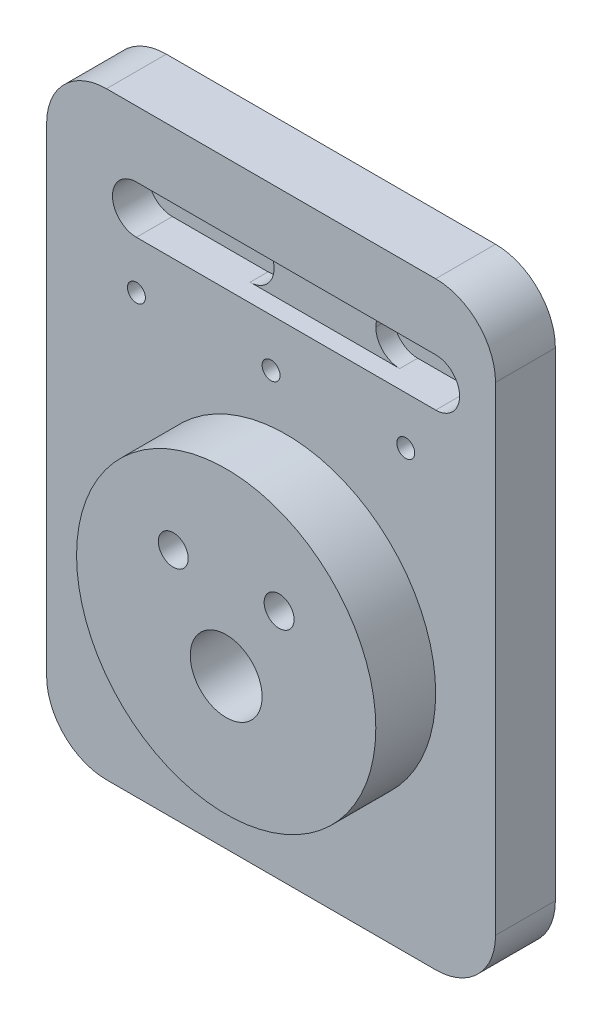
ISO-10303-21;
HEADER;
FILE_DESCRIPTION(('STEP AP214'),'2;1');
FILE_NAME('part.step','',(''),(''),'','','');
FILE_SCHEMA(('AUTOMOTIVE_DESIGN { 1 0 10303 214 1 1 1 1 }'));
ENDSEC;
DATA;
#1=APPLICATION_CONTEXT('core data for automotive mechanical design processes');
#2=APPLICATION_PROTOCOL_DEFINITION('international standard','automotive_design',2000,#1);
#3=PRODUCT_CONTEXT('',#1,'mechanical');
#4=PRODUCT('Part','Part','',(#3));
#5=PRODUCT_RELATED_PRODUCT_CATEGORY('part','',(#4));
#6=PRODUCT_DEFINITION_FORMATION('','',#4);
#7=PRODUCT_DEFINITION_CONTEXT('part definition',#1,'design');
#8=PRODUCT_DEFINITION('design','',#6,#7);
#9=PRODUCT_DEFINITION_SHAPE('','',#8);
#10=(LENGTH_UNIT() NAMED_UNIT(*) SI_UNIT(.MILLI.,.METRE.));
#11=(NAMED_UNIT(*) PLANE_ANGLE_UNIT() SI_UNIT($,.RADIAN.));
#12=(NAMED_UNIT(*) SI_UNIT($,.STERADIAN.) SOLID_ANGLE_UNIT());
#13=UNCERTAINTY_MEASURE_WITH_UNIT(LENGTH_MEASURE(1.E-05),#10,'distance_accuracy_value','');
#14=(GEOMETRIC_REPRESENTATION_CONTEXT(3) GLOBAL_UNCERTAINTY_ASSIGNED_CONTEXT((#13)) GLOBAL_UNIT_ASSIGNED_CONTEXT((#10,
#11,#12)) REPRESENTATION_CONTEXT('',''));
#15=CARTESIAN_POINT('',(0.,0.,0.));
#16=DIRECTION('',(0.,0.,1.));
#17=DIRECTION('',(1.,0.,0.));
#18=AXIS2_PLACEMENT_3D('',#15,#16,#17);
#19=CARTESIAN_POINT('',(15.,89.,4.));
#20=DIRECTION('',(0.,1.,0.));
#21=DIRECTION('',(-1.,0.,0.));
#22=AXIS2_PLACEMENT_3D('',#19,#20,#21);
#23=PLANE('',#22);
#24=DIRECTION('',(-1.,0.,0.));
#25=VECTOR('',#24,1.);
#26=CARTESIAN_POINT('',(35.,89.,7.));
#27=LINE('',#26,#25);
#28=CARTESIAN_POINT('',(56.,89.,7.));
#29=VERTEX_POINT('',#28);
#30=CARTESIAN_POINT('',(31.,89.,7.));
#31=VERTEX_POINT('',#30);
#32=EDGE_CURVE('E386',#29,#31,#27,.T.);
#33=ORIENTED_EDGE('',*,*,#32,.F.);
#34=DIRECTION('',(0.,0.,-1.));
#35=VECTOR('',#34,1.);
#36=CARTESIAN_POINT('',(56.,89.,4.));
#37=LINE('',#36,#35);
#38=CARTESIAN_POINT('',(56.,89.,4.));
#39=VERTEX_POINT('',#38);
#40=EDGE_CURVE('E362',#29,#39,#37,.T.);
#41=ORIENTED_EDGE('',*,*,#40,.T.);
#42=DIRECTION('',(-1.,0.,0.));
#43=VECTOR('',#42,1.);
#44=CARTESIAN_POINT('',(15.,89.,4.));
#45=LINE('',#44,#43);
#46=CARTESIAN_POINT('',(65.,89.,4.));
#47=VERTEX_POINT('',#46);
#48=EDGE_CURVE('E178',#47,#39,#45,.T.);
#49=ORIENTED_EDGE('',*,*,#48,.F.);
#50=DIRECTION('',(0.,0.,1.));
#51=VECTOR('',#50,1.);
#52=CARTESIAN_POINT('',(65.,89.,4.));
#53=LINE('',#52,#51);
#54=CARTESIAN_POINT('',(65.,89.,10.));
#55=VERTEX_POINT('',#54);
#56=EDGE_CURVE('E226',#47,#55,#53,.T.);
#57=ORIENTED_EDGE('',*,*,#56,.T.);
#58=DIRECTION('',(-1.,0.,0.));
#59=VECTOR('',#58,1.);
#60=CARTESIAN_POINT('',(15.,89.,10.));
#61=LINE('',#60,#59);
#62=CARTESIAN_POINT('',(15.,89.,10.));
#63=VERTEX_POINT('',#62);
#64=EDGE_CURVE('E197',#55,#63,#61,.T.);
#65=ORIENTED_EDGE('',*,*,#64,.T.);
#66=DIRECTION('',(0.,0.,1.));
#67=VECTOR('',#66,1.);
#68=CARTESIAN_POINT('',(15.,89.,4.));
#69=LINE('',#68,#67);
#70=CARTESIAN_POINT('',(15.,89.,4.));
#71=VERTEX_POINT('',#70);
#72=EDGE_CURVE('E222',#71,#63,#69,.T.);
#73=ORIENTED_EDGE('',*,*,#72,.F.);
#74=CARTESIAN_POINT('',(31.,89.,4.));
#75=VERTEX_POINT('',#74);
#76=EDGE_CURVE('E194',#75,#71,#45,.T.);
#77=ORIENTED_EDGE('',*,*,#76,.F.);
#78=DIRECTION('',(0.,0.,-1.));
#79=VECTOR('',#78,1.);
#80=CARTESIAN_POINT('',(31.,89.,7.));
#81=LINE('',#80,#79);
#82=EDGE_CURVE('E358',#75,#31,#81,.F.);
#83=ORIENTED_EDGE('',*,*,#82,.T.);
#84=EDGE_LOOP('',(#33,#41,#49,#57,#65,#73,#77,#83));
#85=FACE_BOUND('',#84,.T.);
#86=ADVANCED_FACE('F39',(#85),#23,.F.);
#87=CARTESIAN_POINT('',(15.,81.,4.));
#88=DIRECTION('',(0.,-1.,0.));
#89=DIRECTION('',(0.,0.,-1.));
#90=AXIS2_PLACEMENT_3D('',#87,#88,#89);
#91=PLANE('',#90);
#92=DIRECTION('',(1.,0.,0.));
#93=VECTOR('',#92,1.);
#94=CARTESIAN_POINT('',(15.,81.,4.));
#95=LINE('',#94,#93);
#96=CARTESIAN_POINT('',(56.,81.,4.));
#97=VERTEX_POINT('',#96);
#98=CARTESIAN_POINT('',(65.,81.,4.));
#99=VERTEX_POINT('',#98);
#100=EDGE_CURVE('E190',#97,#99,#95,.T.);
#101=ORIENTED_EDGE('',*,*,#100,.F.);
#102=DIRECTION('',(0.,0.,-1.));
#103=VECTOR('',#102,1.);
#104=CARTESIAN_POINT('',(56.,81.,7.));
#105=LINE('',#104,#103);
#106=CARTESIAN_POINT('',(56.,81.,7.));
#107=VERTEX_POINT('',#106);
#108=EDGE_CURVE('E354',#97,#107,#105,.F.);
#109=ORIENTED_EDGE('',*,*,#108,.T.);
#110=DIRECTION('',(1.,0.,0.));
#111=VECTOR('',#110,1.);
#112=CARTESIAN_POINT('',(35.,81.,7.));
#113=LINE('',#112,#111);
#114=CARTESIAN_POINT('',(31.,81.,7.));
#115=VERTEX_POINT('',#114);
#116=EDGE_CURVE('E380',#115,#107,#113,.T.);
#117=ORIENTED_EDGE('',*,*,#116,.F.);
#118=DIRECTION('',(0.,0.,-1.));
#119=VECTOR('',#118,1.);
#120=CARTESIAN_POINT('',(31.,81.,4.));
#121=LINE('',#120,#119);
#122=CARTESIAN_POINT('',(31.,81.,4.));
#123=VERTEX_POINT('',#122);
#124=EDGE_CURVE('E186',#115,#123,#121,.T.);
#125=ORIENTED_EDGE('',*,*,#124,.T.);
#126=CARTESIAN_POINT('',(15.,81.,4.));
#127=VERTEX_POINT('',#126);
#128=EDGE_CURVE('E182',#127,#123,#95,.T.);
#129=ORIENTED_EDGE('',*,*,#128,.F.);
#130=DIRECTION('',(0.,0.,1.));
#131=VECTOR('',#130,1.);
#132=CARTESIAN_POINT('',(15.,81.,4.));
#133=LINE('',#132,#131);
#134=CARTESIAN_POINT('',(15.,81.,10.));
#135=VERTEX_POINT('',#134);
#136=EDGE_CURVE('E166',#127,#135,#133,.T.);
#137=ORIENTED_EDGE('',*,*,#136,.T.);
#138=DIRECTION('',(1.,0.,0.));
#139=VECTOR('',#138,1.);
#140=CARTESIAN_POINT('',(15.,81.,10.));
#141=LINE('',#140,#139);
#142=CARTESIAN_POINT('',(65.,81.,10.));
#143=VERTEX_POINT('',#142);
#144=EDGE_CURVE('E216',#135,#143,#141,.T.);
#145=ORIENTED_EDGE('',*,*,#144,.T.);
#146=DIRECTION('',(0.,0.,1.));
#147=VECTOR('',#146,1.);
#148=CARTESIAN_POINT('',(65.,81.,4.));
#149=LINE('',#148,#147);
#150=EDGE_CURVE('E177',#99,#143,#149,.T.);
#151=ORIENTED_EDGE('',*,*,#150,.F.);
#152=EDGE_LOOP('',(#101,#109,#117,#125,#129,#137,#145,#151));
#153=FACE_BOUND('',#152,.T.);
#154=ADVANCED_FACE('F184',(#153),#91,.F.);
#155=CARTESIAN_POINT('',(15.,85.,4.));
#156=DIRECTION('',(0.,0.,1.));
#157=DIRECTION('',(1.,0.,0.));
#158=AXIS2_PLACEMENT_3D('',#155,#156,#157);
#159=PLANE('',#158);
#160=ORIENTED_EDGE('',*,*,#128,.T.);
#161=CARTESIAN_POINT('',(31.,85.,4.));
#162=DIRECTION('',(0.,0.,1.));
#163=DIRECTION('',(1.,0.,0.));
#164=AXIS2_PLACEMENT_3D('',#161,#162,#163);
#165=CIRCLE('',#164,4.);
#166=CARTESIAN_POINT('',(35.,85.,4.));
#167=VERTEX_POINT('',#166);
#168=EDGE_CURVE('E368',#123,#167,#165,.T.);
#169=ORIENTED_EDGE('',*,*,#168,.T.);
#170=CARTESIAN_POINT('',(31.,85.,4.));
#171=DIRECTION('',(0.,0.,1.));
#172=DIRECTION('',(1.,0.,0.));
#173=AXIS2_PLACEMENT_3D('',#170,#171,#172);
#174=CIRCLE('',#173,4.);
#175=EDGE_CURVE('E365',#167,#75,#174,.T.);
#176=ORIENTED_EDGE('',*,*,#175,.T.);
#177=ORIENTED_EDGE('',*,*,#76,.T.);
#178=CARTESIAN_POINT('',(15.,85.,4.));
#179=DIRECTION('',(0.,0.,1.));
#180=DIRECTION('',(1.,0.,0.));
#181=AXIS2_PLACEMENT_3D('',#178,#179,#180);
#182=CIRCLE('',#181,3.99999999999999);
#183=EDGE_CURVE('E170',#71,#127,#182,.T.);
#184=ORIENTED_EDGE('',*,*,#183,.T.);
#185=EDGE_LOOP('',(#160,#169,#176,#177,#184));
#186=FACE_BOUND('',#185,.T.);
#187=ADVANCED_FACE('F192',(#186),#159,.T.);
#188=CARTESIAN_POINT('',(56.,85.,4.));
#189=DIRECTION('',(0.,0.,1.));
#190=DIRECTION('',(1.,0.,0.));
#191=AXIS2_PLACEMENT_3D('',#188,#189,#190);
#192=CIRCLE('',#191,4.);
#193=CARTESIAN_POINT('',(52.,85.,4.));
#194=VERTEX_POINT('',#193);
#195=EDGE_CURVE('E346',#39,#194,#192,.T.);
#196=ORIENTED_EDGE('',*,*,#195,.T.);
#197=CARTESIAN_POINT('',(56.,85.,4.));
#198=DIRECTION('',(0.,0.,1.));
#199=DIRECTION('',(1.,0.,0.));
#200=AXIS2_PLACEMENT_3D('',#197,#198,#199);
#201=CIRCLE('',#200,4.);
#202=EDGE_CURVE('E349',#194,#97,#201,.T.);
#203=ORIENTED_EDGE('',*,*,#202,.T.);
#204=ORIENTED_EDGE('',*,*,#100,.T.);
#205=CARTESIAN_POINT('',(65.,85.,4.));
#206=DIRECTION('',(0.,0.,1.));
#207=DIRECTION('',(1.,0.,0.));
#208=AXIS2_PLACEMENT_3D('',#205,#206,#207);
#209=CIRCLE('',#208,4.);
#210=EDGE_CURVE('E189',#99,#47,#209,.T.);
#211=ORIENTED_EDGE('',*,*,#210,.T.);
#212=ORIENTED_EDGE('',*,*,#48,.T.);
#213=EDGE_LOOP('',(#196,#203,#204,#211,#212));
#214=FACE_BOUND('',#213,.T.);
#215=ADVANCED_FACE('F409',(#214),#159,.T.);
#216=CARTESIAN_POINT('',(0.,0.,0.));
#217=DIRECTION('',(0.,0.,-1.));
#218=DIRECTION('',(-1.,0.,0.));
#219=AXIS2_PLACEMENT_3D('',#216,#217,#218);
#220=PLANE('',#219);
#221=CARTESIAN_POINT('',(15.,73.,0.));
#222=DIRECTION('',(0.,0.,1.));
#223=DIRECTION('',(1.,0.,0.));
#224=AXIS2_PLACEMENT_3D('',#221,#222,#223);
#225=CIRCLE('',#224,1.5);
#226=CARTESIAN_POINT('',(16.5,73.,0.));
#227=VERTEX_POINT('',#226);
#228=EDGE_CURVE('E681',#227,#227,#225,.T.);
#229=ORIENTED_EDGE('',*,*,#228,.T.);
#230=EDGE_LOOP('',(#229));
#231=FACE_BOUND('',#230,.T.);
#232=CARTESIAN_POINT('',(37.5,73.,0.));
#233=DIRECTION('',(0.,0.,1.));
#234=DIRECTION('',(1.,0.,0.));
#235=AXIS2_PLACEMENT_3D('',#232,#233,#234);
#236=CIRCLE('',#235,1.49999999999999);
#237=CARTESIAN_POINT('',(39.,73.,0.));
#238=VERTEX_POINT('',#237);
#239=EDGE_CURVE('E675',#238,#238,#236,.T.);
#240=ORIENTED_EDGE('',*,*,#239,.T.);
#241=EDGE_LOOP('',(#240));
#242=FACE_BOUND('',#241,.T.);
#243=CARTESIAN_POINT('',(60.,73.,0.));
#244=DIRECTION('',(0.,0.,1.));
#245=DIRECTION('',(1.,0.,0.));
#246=AXIS2_PLACEMENT_3D('',#243,#244,#245);
#247=CIRCLE('',#246,1.5);
#248=CARTESIAN_POINT('',(61.5,73.,0.));
#249=VERTEX_POINT('',#248);
#250=EDGE_CURVE('E205',#249,#249,#247,.T.);
#251=ORIENTED_EDGE('',*,*,#250,.T.);
#252=EDGE_LOOP('',(#251));
#253=FACE_BOUND('',#252,.T.);
#254=CARTESIAN_POINT('',(40.,35.,0.));
#255=DIRECTION('',(0.,0.,1.));
#256=DIRECTION('',(1.,0.,0.));
#257=AXIS2_PLACEMENT_3D('',#254,#255,#256);
#258=CIRCLE('',#257,6.);
#259=CARTESIAN_POINT('',(46.,35.,0.));
#260=VERTEX_POINT('',#259);
#261=EDGE_CURVE('E234',#260,#260,#258,.T.);
#262=ORIENTED_EDGE('',*,*,#261,.T.);
#263=EDGE_LOOP('',(#262));
#264=FACE_BOUND('',#263,.T.);
#265=DIRECTION('',(1.,0.,0.));
#266=VECTOR('',#265,1.);
#267=CARTESIAN_POINT('',(0.,0.,0.));
#268=LINE('',#267,#266);
#269=CARTESIAN_POINT('',(10.,0.,0.));
#270=VERTEX_POINT('',#269);
#271=CARTESIAN_POINT('',(65.,0.,0.));
#272=VERTEX_POINT('',#271);
#273=EDGE_CURVE('E284',#270,#272,#268,.T.);
#274=ORIENTED_EDGE('',*,*,#273,.F.);
#275=CARTESIAN_POINT('',(10.,10.,0.));
#276=DIRECTION('',(0.,0.,-1.));
#277=DIRECTION('',(-1.,0.,0.));
#278=AXIS2_PLACEMENT_3D('',#275,#276,#277);
#279=CIRCLE('',#278,10.);
#280=CARTESIAN_POINT('',(0.,10.,0.));
#281=VERTEX_POINT('',#280);
#282=EDGE_CURVE('E310',#270,#281,#279,.T.);
#283=ORIENTED_EDGE('',*,*,#282,.T.);
#284=DIRECTION('',(0.,-1.,0.));
#285=VECTOR('',#284,1.);
#286=CARTESIAN_POINT('',(0.,0.,0.));
#287=LINE('',#286,#285);
#288=CARTESIAN_POINT('',(0.,90.,0.));
#289=VERTEX_POINT('',#288);
#290=EDGE_CURVE('E258',#289,#281,#287,.T.);
#291=ORIENTED_EDGE('',*,*,#290,.F.);
#292=CARTESIAN_POINT('',(10.,90.,0.));
#293=DIRECTION('',(0.,0.,-1.));
#294=DIRECTION('',(-1.,0.,0.));
#295=AXIS2_PLACEMENT_3D('',#292,#293,#294);
#296=CIRCLE('',#295,10.);
#297=CARTESIAN_POINT('',(10.,100.,0.));
#298=VERTEX_POINT('',#297);
#299=EDGE_CURVE('E301',#289,#298,#296,.T.);
#300=ORIENTED_EDGE('',*,*,#299,.T.);
#301=DIRECTION('',(-1.,0.,0.));
#302=VECTOR('',#301,1.);
#303=CARTESIAN_POINT('',(0.,100.,0.));
#304=LINE('',#303,#302);
#305=CARTESIAN_POINT('',(65.,100.,0.));
#306=VERTEX_POINT('',#305);
#307=EDGE_CURVE('E270',#306,#298,#304,.T.);
#308=ORIENTED_EDGE('',*,*,#307,.F.);
#309=CARTESIAN_POINT('',(65.,90.,0.));
#310=DIRECTION('',(0.,0.,-1.));
#311=DIRECTION('',(-1.,0.,0.));
#312=AXIS2_PLACEMENT_3D('',#309,#310,#311);
#313=CIRCLE('',#312,10.);
#314=CARTESIAN_POINT('',(75.,90.,0.));
#315=VERTEX_POINT('',#314);
#316=EDGE_CURVE('E304',#306,#315,#313,.T.);
#317=ORIENTED_EDGE('',*,*,#316,.T.);
#318=DIRECTION('',(0.,1.,0.));
#319=VECTOR('',#318,1.);
#320=CARTESIAN_POINT('',(75.,0.,0.));
#321=LINE('',#320,#319);
#322=CARTESIAN_POINT('',(75.,10.,0.));
#323=VERTEX_POINT('',#322);
#324=EDGE_CURVE('E288',#323,#315,#321,.T.);
#325=ORIENTED_EDGE('',*,*,#324,.F.);
#326=CARTESIAN_POINT('',(65.,10.,0.));
#327=DIRECTION('',(0.,0.,-1.));
#328=DIRECTION('',(-1.,0.,0.));
#329=AXIS2_PLACEMENT_3D('',#326,#327,#328);
#330=CIRCLE('',#329,10.);
#331=EDGE_CURVE('E307',#323,#272,#330,.T.);
#332=ORIENTED_EDGE('',*,*,#331,.T.);
#333=EDGE_LOOP('',(#274,#283,#291,#300,#308,#317,#325,#332));
#334=FACE_BOUND('',#333,.T.);
#335=CARTESIAN_POINT('',(48.8388347648318,48.8388347648319,0.));
#336=DIRECTION('',(0.,0.,1.));
#337=DIRECTION('',(1.,0.,0.));
#338=AXIS2_PLACEMENT_3D('',#335,#336,#337);
#339=CIRCLE('',#338,2.5);
#340=CARTESIAN_POINT('',(51.3388347648318,48.8388347648319,0.));
#341=VERTEX_POINT('',#340);
#342=EDGE_CURVE('E250',#341,#341,#339,.T.);
#343=ORIENTED_EDGE('',*,*,#342,.T.);
#344=EDGE_LOOP('',(#343));
#345=FACE_BOUND('',#344,.T.);
#346=CARTESIAN_POINT('',(31.1611652351681,48.8388347648318,0.));
#347=DIRECTION('',(0.,0.,1.));
#348=DIRECTION('',(1.,0.,0.));
#349=AXIS2_PLACEMENT_3D('',#346,#347,#348);
#350=CIRCLE('',#349,2.5);
#351=CARTESIAN_POINT('',(33.6611652351681,48.8388347648318,0.));
#352=VERTEX_POINT('',#351);
#353=EDGE_CURVE('E242',#352,#352,#350,.T.);
#354=ORIENTED_EDGE('',*,*,#353,.T.);
#355=EDGE_LOOP('',(#354));
#356=FACE_BOUND('',#355,.T.);
#357=ADVANCED_FACE('F466',(#231,#242,#253,#264,#334,#345,#356),#220,.T.);
#358=CARTESIAN_POINT('',(0.,0.,10.));
#359=DIRECTION('',(1.,0.,0.));
#360=DIRECTION('',(0.,0.,-1.));
#361=AXIS2_PLACEMENT_3D('',#358,#359,#360);
#362=PLANE('',#361);
#363=ORIENTED_EDGE('',*,*,#290,.T.);
#364=DIRECTION('',(0.,0.,-1.));
#365=VECTOR('',#364,1.);
#366=CARTESIAN_POINT('',(0.,10.,10.));
#367=LINE('',#366,#365);
#368=CARTESIAN_POINT('',(0.,10.,10.));
#369=VERTEX_POINT('',#368);
#370=EDGE_CURVE('E317',#281,#369,#367,.F.);
#371=ORIENTED_EDGE('',*,*,#370,.T.);
#372=DIRECTION('',(0.,-1.,0.));
#373=VECTOR('',#372,1.);
#374=CARTESIAN_POINT('',(0.,0.,10.));
#375=LINE('',#374,#373);
#376=CARTESIAN_POINT('',(0.,90.,10.));
#377=VERTEX_POINT('',#376);
#378=EDGE_CURVE('E265',#377,#369,#375,.T.);
#379=ORIENTED_EDGE('',*,*,#378,.F.);
#380=DIRECTION('',(0.,0.,-1.));
#381=VECTOR('',#380,1.);
#382=CARTESIAN_POINT('',(0.,90.,10.));
#383=LINE('',#382,#381);
#384=EDGE_CURVE('E313',#377,#289,#383,.T.);
#385=ORIENTED_EDGE('',*,*,#384,.T.);
#386=EDGE_LOOP('',(#363,#371,#379,#385));
#387=FACE_BOUND('',#386,.T.);
#388=ADVANCED_FACE('F469',(#387),#362,.F.);
#389=CARTESIAN_POINT('',(0.,0.,10.));
#390=DIRECTION('',(0.,1.,0.));
#391=DIRECTION('',(0.,0.,1.));
#392=AXIS2_PLACEMENT_3D('',#389,#390,#391);
#393=PLANE('',#392);
#394=DIRECTION('',(1.,0.,0.));
#395=VECTOR('',#394,1.);
#396=CARTESIAN_POINT('',(0.,0.,10.));
#397=LINE('',#396,#395);
#398=CARTESIAN_POINT('',(10.,0.,10.));
#399=VERTEX_POINT('',#398);
#400=CARTESIAN_POINT('',(65.,0.,10.));
#401=VERTEX_POINT('',#400);
#402=EDGE_CURVE('E269',#399,#401,#397,.T.);
#403=ORIENTED_EDGE('',*,*,#402,.F.);
#404=DIRECTION('',(0.,0.,-1.));
#405=VECTOR('',#404,1.);
#406=CARTESIAN_POINT('',(10.,0.,10.));
#407=LINE('',#406,#405);
#408=EDGE_CURVE('E297',#399,#270,#407,.T.);
#409=ORIENTED_EDGE('',*,*,#408,.T.);
#410=ORIENTED_EDGE('',*,*,#273,.T.);
#411=DIRECTION('',(0.,0.,-1.));
#412=VECTOR('',#411,1.);
#413=CARTESIAN_POINT('',(65.,0.,10.));
#414=LINE('',#413,#412);
#415=EDGE_CURVE('E263',#272,#401,#414,.F.);
#416=ORIENTED_EDGE('',*,*,#415,.T.);
#417=EDGE_LOOP('',(#403,#409,#410,#416));
#418=FACE_BOUND('',#417,.T.);
#419=ADVANCED_FACE('F477',(#418),#393,.F.);
#420=CARTESIAN_POINT('',(75.,0.,10.));
#421=DIRECTION('',(-1.,0.,0.));
#422=DIRECTION('',(0.,0.,1.));
#423=AXIS2_PLACEMENT_3D('',#420,#421,#422);
#424=PLANE('',#423);
#425=DIRECTION('',(0.,1.,0.));
#426=VECTOR('',#425,1.);
#427=CARTESIAN_POINT('',(75.,0.,10.));
#428=LINE('',#427,#426);
#429=CARTESIAN_POINT('',(75.,10.,10.));
#430=VERTEX_POINT('',#429);
#431=CARTESIAN_POINT('',(75.,90.,10.));
#432=VERTEX_POINT('',#431);
#433=EDGE_CURVE('E274',#430,#432,#428,.T.);
#434=ORIENTED_EDGE('',*,*,#433,.F.);
#435=DIRECTION('',(0.,0.,-1.));
#436=VECTOR('',#435,1.);
#437=CARTESIAN_POINT('',(75.,10.,10.));
#438=LINE('',#437,#436);
#439=EDGE_CURVE('E335',#430,#323,#438,.T.);
#440=ORIENTED_EDGE('',*,*,#439,.T.);
#441=ORIENTED_EDGE('',*,*,#324,.T.);
#442=DIRECTION('',(0.,0.,-1.));
#443=VECTOR('',#442,1.);
#444=CARTESIAN_POINT('',(75.,90.,10.));
#445=LINE('',#444,#443);
#446=EDGE_CURVE('E332',#315,#432,#445,.F.);
#447=ORIENTED_EDGE('',*,*,#446,.T.);
#448=EDGE_LOOP('',(#434,#440,#441,#447));
#449=FACE_BOUND('',#448,.T.);
#450=ADVANCED_FACE('F473',(#449),#424,.F.);
#451=CARTESIAN_POINT('',(0.,100.,10.));
#452=DIRECTION('',(0.,-1.,0.));
#453=DIRECTION('',(0.,0.,-1.));
#454=AXIS2_PLACEMENT_3D('',#451,#452,#453);
#455=PLANE('',#454);
#456=DIRECTION('',(-1.,0.,0.));
#457=VECTOR('',#456,1.);
#458=CARTESIAN_POINT('',(0.,100.,10.));
#459=LINE('',#458,#457);
#460=CARTESIAN_POINT('',(65.,100.,10.));
#461=VERTEX_POINT('',#460);
#462=CARTESIAN_POINT('',(10.,100.,10.));
#463=VERTEX_POINT('',#462);
#464=EDGE_CURVE('E264',#461,#463,#459,.T.);
#465=ORIENTED_EDGE('',*,*,#464,.F.);
#466=DIRECTION('',(0.,0.,-1.));
#467=VECTOR('',#466,1.);
#468=CARTESIAN_POINT('',(65.,100.,10.));
#469=LINE('',#468,#467);
#470=EDGE_CURVE('E342',#461,#306,#469,.T.);
#471=ORIENTED_EDGE('',*,*,#470,.T.);
#472=ORIENTED_EDGE('',*,*,#307,.T.);
#473=DIRECTION('',(0.,0.,-1.));
#474=VECTOR('',#473,1.);
#475=CARTESIAN_POINT('',(10.,100.,10.));
#476=LINE('',#475,#474);
#477=EDGE_CURVE('E339',#298,#463,#476,.F.);
#478=ORIENTED_EDGE('',*,*,#477,.T.);
#479=EDGE_LOOP('',(#465,#471,#472,#478));
#480=FACE_BOUND('',#479,.T.);
#481=ADVANCED_FACE('F464',(#480),#455,.F.);
#482=CARTESIAN_POINT('',(0.,0.,10.));
#483=DIRECTION('',(0.,0.,-1.));
#484=DIRECTION('',(-1.,0.,0.));
#485=AXIS2_PLACEMENT_3D('',#482,#483,#484);
#486=PLANE('',#485);
#487=CARTESIAN_POINT('',(15.,73.,10.));
#488=DIRECTION('',(0.,0.,1.));
#489=DIRECTION('',(1.,0.,0.));
#490=AXIS2_PLACEMENT_3D('',#487,#488,#489);
#491=CIRCLE('',#490,1.5);
#492=CARTESIAN_POINT('',(16.5,73.,10.));
#493=VERTEX_POINT('',#492);
#494=EDGE_CURVE('E688',#493,#493,#491,.T.);
#495=ORIENTED_EDGE('',*,*,#494,.F.);
#496=EDGE_LOOP('',(#495));
#497=FACE_BOUND('',#496,.T.);
#498=CARTESIAN_POINT('',(37.5,73.,10.));
#499=DIRECTION('',(0.,0.,1.));
#500=DIRECTION('',(1.,0.,0.));
#501=AXIS2_PLACEMENT_3D('',#498,#499,#500);
#502=CIRCLE('',#501,1.5);
#503=CARTESIAN_POINT('',(39.,73.,10.));
#504=VERTEX_POINT('',#503);
#505=EDGE_CURVE('E678',#504,#504,#502,.T.);
#506=ORIENTED_EDGE('',*,*,#505,.F.);
#507=EDGE_LOOP('',(#506));
#508=FACE_BOUND('',#507,.T.);
#509=CARTESIAN_POINT('',(60.,73.,10.));
#510=DIRECTION('',(0.,0.,1.));
#511=DIRECTION('',(1.,0.,0.));
#512=AXIS2_PLACEMENT_3D('',#509,#510,#511);
#513=CIRCLE('',#512,1.5);
#514=CARTESIAN_POINT('',(61.5,73.,10.));
#515=VERTEX_POINT('',#514);
#516=EDGE_CURVE('E685',#515,#515,#513,.T.);
#517=ORIENTED_EDGE('',*,*,#516,.F.);
#518=EDGE_LOOP('',(#517));
#519=FACE_BOUND('',#518,.T.);
#520=ORIENTED_EDGE('',*,*,#144,.F.);
#521=CARTESIAN_POINT('',(15.,85.,10.));
#522=DIRECTION('',(0.,0.,1.));
#523=DIRECTION('',(1.,0.,0.));
#524=AXIS2_PLACEMENT_3D('',#521,#522,#523);
#525=CIRCLE('',#524,3.99999999999999);
#526=EDGE_CURVE('E172',#63,#135,#525,.T.);
#527=ORIENTED_EDGE('',*,*,#526,.F.);
#528=ORIENTED_EDGE('',*,*,#64,.F.);
#529=CARTESIAN_POINT('',(65.,85.,10.));
#530=DIRECTION('',(0.,0.,1.));
#531=DIRECTION('',(1.,0.,0.));
#532=AXIS2_PLACEMENT_3D('',#529,#530,#531);
#533=CIRCLE('',#532,4.);
#534=EDGE_CURVE('E202',#143,#55,#533,.T.);
#535=ORIENTED_EDGE('',*,*,#534,.F.);
#536=EDGE_LOOP('',(#520,#527,#528,#535));
#537=FACE_BOUND('',#536,.T.);
#538=CARTESIAN_POINT('',(40.,40.,10.));
#539=DIRECTION('',(0.,0.,1.));
#540=DIRECTION('',(1.,0.,0.));
#541=AXIS2_PLACEMENT_3D('',#538,#539,#540);
#542=CIRCLE('',#541,25.);
#543=CARTESIAN_POINT('',(65.,40.,10.));
#544=VERTEX_POINT('',#543);
#545=EDGE_CURVE('E259',#544,#544,#542,.T.);
#546=ORIENTED_EDGE('',*,*,#545,.F.);
#547=EDGE_LOOP('',(#546));
#548=FACE_BOUND('',#547,.T.);
#549=ORIENTED_EDGE('',*,*,#378,.T.);
#550=CARTESIAN_POINT('',(10.,10.,10.));
#551=DIRECTION('',(0.,0.,-1.));
#552=DIRECTION('',(-1.,0.,0.));
#553=AXIS2_PLACEMENT_3D('',#550,#551,#552);
#554=CIRCLE('',#553,10.);
#555=EDGE_CURVE('E329',#369,#399,#554,.F.);
#556=ORIENTED_EDGE('',*,*,#555,.T.);
#557=ORIENTED_EDGE('',*,*,#402,.T.);
#558=CARTESIAN_POINT('',(65.,10.,10.));
#559=DIRECTION('',(0.,0.,-1.));
#560=DIRECTION('',(-1.,0.,0.));
#561=AXIS2_PLACEMENT_3D('',#558,#559,#560);
#562=CIRCLE('',#561,10.);
#563=EDGE_CURVE('E326',#401,#430,#562,.F.);
#564=ORIENTED_EDGE('',*,*,#563,.T.);
#565=ORIENTED_EDGE('',*,*,#433,.T.);
#566=CARTESIAN_POINT('',(65.,90.,10.));
#567=DIRECTION('',(0.,0.,-1.));
#568=DIRECTION('',(-1.,0.,0.));
#569=AXIS2_PLACEMENT_3D('',#566,#567,#568);
#570=CIRCLE('',#569,10.);
#571=EDGE_CURVE('E323',#432,#461,#570,.F.);
#572=ORIENTED_EDGE('',*,*,#571,.T.);
#573=ORIENTED_EDGE('',*,*,#464,.T.);
#574=CARTESIAN_POINT('',(10.,90.,10.));
#575=DIRECTION('',(0.,0.,-1.));
#576=DIRECTION('',(-1.,0.,0.));
#577=AXIS2_PLACEMENT_3D('',#574,#575,#576);
#578=CIRCLE('',#577,10.);
#579=EDGE_CURVE('E320',#463,#377,#578,.F.);
#580=ORIENTED_EDGE('',*,*,#579,.T.);
#581=EDGE_LOOP('',(#549,#556,#557,#564,#565,#572,#573,#580));
#582=FACE_BOUND('',#581,.T.);
#583=ADVANCED_FACE('F401',(#497,#508,#519,#537,#548,#582),#486,.F.);
#584=CARTESIAN_POINT('',(40.,40.,20.));
#585=DIRECTION('',(0.,0.,-1.));
#586=DIRECTION('',(-1.,0.,0.));
#587=AXIS2_PLACEMENT_3D('',#584,#585,#586);
#588=CYLINDRICAL_SURFACE('',#587,25.);
#589=CARTESIAN_POINT('',(40.,40.,20.));
#590=DIRECTION('',(0.,0.,1.));
#591=DIRECTION('',(1.,0.,0.));
#592=AXIS2_PLACEMENT_3D('',#589,#590,#591);
#593=CIRCLE('',#592,25.);
#594=CARTESIAN_POINT('',(65.,40.,20.));
#595=VERTEX_POINT('',#594);
#596=EDGE_CURVE('E254',#595,#595,#593,.T.);
#597=ORIENTED_EDGE('',*,*,#596,.F.);
#598=EDGE_LOOP('',(#597));
#599=FACE_BOUND('',#598,.T.);
#600=ORIENTED_EDGE('',*,*,#545,.T.);
#601=EDGE_LOOP('',(#600));
#602=FACE_BOUND('',#601,.T.);
#603=ADVANCED_FACE('F457',(#599,#602),#588,.T.);
#604=CARTESIAN_POINT('',(40.,40.,20.));
#605=DIRECTION('',(0.,0.,1.));
#606=DIRECTION('',(1.,0.,0.));
#607=AXIS2_PLACEMENT_3D('',#604,#605,#606);
#608=PLANE('',#607);
#609=CARTESIAN_POINT('',(40.,35.,20.));
#610=DIRECTION('',(0.,0.,1.));
#611=DIRECTION('',(1.,0.,0.));
#612=AXIS2_PLACEMENT_3D('',#609,#610,#611);
#613=CIRCLE('',#612,6.);
#614=CARTESIAN_POINT('',(46.,35.,20.));
#615=VERTEX_POINT('',#614);
#616=EDGE_CURVE('E225',#615,#615,#613,.T.);
#617=ORIENTED_EDGE('',*,*,#616,.F.);
#618=EDGE_LOOP('',(#617));
#619=FACE_BOUND('',#618,.T.);
#620=CARTESIAN_POINT('',(31.1611652351681,48.8388347648318,20.));
#621=DIRECTION('',(0.,0.,1.));
#622=DIRECTION('',(1.,0.,0.));
#623=AXIS2_PLACEMENT_3D('',#620,#621,#622);
#624=CIRCLE('',#623,2.5);
#625=CARTESIAN_POINT('',(33.6611652351681,48.8388347648318,20.));
#626=VERTEX_POINT('',#625);
#627=EDGE_CURVE('E238',#626,#626,#624,.T.);
#628=ORIENTED_EDGE('',*,*,#627,.F.);
#629=EDGE_LOOP('',(#628));
#630=FACE_BOUND('',#629,.T.);
#631=CARTESIAN_POINT('',(48.8388347648318,48.8388347648319,20.));
#632=DIRECTION('',(0.,0.,1.));
#633=DIRECTION('',(1.,0.,0.));
#634=AXIS2_PLACEMENT_3D('',#631,#632,#633);
#635=CIRCLE('',#634,2.5);
#636=CARTESIAN_POINT('',(51.3388347648318,48.8388347648319,20.));
#637=VERTEX_POINT('',#636);
#638=EDGE_CURVE('E246',#637,#637,#635,.T.);
#639=ORIENTED_EDGE('',*,*,#638,.F.);
#640=EDGE_LOOP('',(#639));
#641=FACE_BOUND('',#640,.T.);
#642=ORIENTED_EDGE('',*,*,#596,.T.);
#643=EDGE_LOOP('',(#642));
#644=FACE_BOUND('',#643,.T.);
#645=ADVANCED_FACE('F453',(#619,#630,#641,#644),#608,.T.);
#646=CARTESIAN_POINT('',(48.8388347648318,48.8388347648319,20.));
#647=DIRECTION('',(0.,0.,1.));
#648=DIRECTION('',(1.,0.,0.));
#649=AXIS2_PLACEMENT_3D('',#646,#647,#648);
#650=CYLINDRICAL_SURFACE('',#649,2.5);
#651=ORIENTED_EDGE('',*,*,#342,.F.);
#652=EDGE_LOOP('',(#651));
#653=FACE_BOUND('',#652,.T.);
#654=ORIENTED_EDGE('',*,*,#638,.T.);
#655=EDGE_LOOP('',(#654));
#656=FACE_BOUND('',#655,.T.);
#657=ADVANCED_FACE('F449',(#653,#656),#650,.F.);
#658=CARTESIAN_POINT('',(31.1611652351681,48.8388347648318,20.));
#659=DIRECTION('',(0.,0.,1.));
#660=DIRECTION('',(1.,0.,0.));
#661=AXIS2_PLACEMENT_3D('',#658,#659,#660);
#662=CYLINDRICAL_SURFACE('',#661,2.5);
#663=ORIENTED_EDGE('',*,*,#353,.F.);
#664=EDGE_LOOP('',(#663));
#665=FACE_BOUND('',#664,.T.);
#666=ORIENTED_EDGE('',*,*,#627,.T.);
#667=EDGE_LOOP('',(#666));
#668=FACE_BOUND('',#667,.T.);
#669=ADVANCED_FACE('F445',(#665,#668),#662,.F.);
#670=CARTESIAN_POINT('',(40.,35.,20.));
#671=DIRECTION('',(0.,0.,1.));
#672=DIRECTION('',(1.,0.,0.));
#673=AXIS2_PLACEMENT_3D('',#670,#671,#672);
#674=CYLINDRICAL_SURFACE('',#673,6.);
#675=ORIENTED_EDGE('',*,*,#261,.F.);
#676=EDGE_LOOP('',(#675));
#677=FACE_BOUND('',#676,.T.);
#678=ORIENTED_EDGE('',*,*,#616,.T.);
#679=EDGE_LOOP('',(#678));
#680=FACE_BOUND('',#679,.T.);
#681=ADVANCED_FACE('F442',(#677,#680),#674,.F.);
#682=CARTESIAN_POINT('',(15.,85.,4.));
#683=DIRECTION('',(0.,0.,1.));
#684=DIRECTION('',(1.,0.,0.));
#685=AXIS2_PLACEMENT_3D('',#682,#683,#684);
#686=CYLINDRICAL_SURFACE('',#685,3.99999999999999);
#687=ORIENTED_EDGE('',*,*,#526,.T.);
#688=ORIENTED_EDGE('',*,*,#136,.F.);
#689=ORIENTED_EDGE('',*,*,#183,.F.);
#690=ORIENTED_EDGE('',*,*,#72,.T.);
#691=EDGE_LOOP('',(#687,#688,#689,#690));
#692=FACE_BOUND('',#691,.T.);
#693=ADVANCED_FACE('F168',(#692),#686,.F.);
#694=CARTESIAN_POINT('',(65.,85.,4.));
#695=DIRECTION('',(0.,0.,1.));
#696=DIRECTION('',(1.,0.,0.));
#697=AXIS2_PLACEMENT_3D('',#694,#695,#696);
#698=CYLINDRICAL_SURFACE('',#697,4.);
#699=ORIENTED_EDGE('',*,*,#534,.T.);
#700=ORIENTED_EDGE('',*,*,#56,.F.);
#701=ORIENTED_EDGE('',*,*,#210,.F.);
#702=ORIENTED_EDGE('',*,*,#150,.T.);
#703=EDGE_LOOP('',(#699,#700,#701,#702));
#704=FACE_BOUND('',#703,.T.);
#705=ADVANCED_FACE('F407',(#704),#698,.F.);
#706=CARTESIAN_POINT('',(10.,10.,10.));
#707=DIRECTION('',(0.,0.,-1.));
#708=DIRECTION('',(-1.,0.,0.));
#709=AXIS2_PLACEMENT_3D('',#706,#707,#708);
#710=CYLINDRICAL_SURFACE('',#709,10.);
#711=ORIENTED_EDGE('',*,*,#555,.F.);
#712=ORIENTED_EDGE('',*,*,#370,.F.);
#713=ORIENTED_EDGE('',*,*,#282,.F.);
#714=ORIENTED_EDGE('',*,*,#408,.F.);
#715=EDGE_LOOP('',(#711,#712,#713,#714));
#716=FACE_BOUND('',#715,.T.);
#717=ADVANCED_FACE('F438',(#716),#710,.T.);
#718=CARTESIAN_POINT('',(65.,10.,10.));
#719=DIRECTION('',(0.,0.,-1.));
#720=DIRECTION('',(-1.,0.,0.));
#721=AXIS2_PLACEMENT_3D('',#718,#719,#720);
#722=CYLINDRICAL_SURFACE('',#721,10.);
#723=ORIENTED_EDGE('',*,*,#563,.F.);
#724=ORIENTED_EDGE('',*,*,#415,.F.);
#725=ORIENTED_EDGE('',*,*,#331,.F.);
#726=ORIENTED_EDGE('',*,*,#439,.F.);
#727=EDGE_LOOP('',(#723,#724,#725,#726));
#728=FACE_BOUND('',#727,.T.);
#729=ADVANCED_FACE('F487',(#728),#722,.T.);
#730=CARTESIAN_POINT('',(65.,90.,10.));
#731=DIRECTION('',(0.,0.,-1.));
#732=DIRECTION('',(-1.,0.,0.));
#733=AXIS2_PLACEMENT_3D('',#730,#731,#732);
#734=CYLINDRICAL_SURFACE('',#733,10.);
#735=ORIENTED_EDGE('',*,*,#571,.F.);
#736=ORIENTED_EDGE('',*,*,#446,.F.);
#737=ORIENTED_EDGE('',*,*,#316,.F.);
#738=ORIENTED_EDGE('',*,*,#470,.F.);
#739=EDGE_LOOP('',(#735,#736,#737,#738));
#740=FACE_BOUND('',#739,.T.);
#741=ADVANCED_FACE('F491',(#740),#734,.T.);
#742=CARTESIAN_POINT('',(10.,90.,10.));
#743=DIRECTION('',(0.,0.,-1.));
#744=DIRECTION('',(-1.,0.,0.));
#745=AXIS2_PLACEMENT_3D('',#742,#743,#744);
#746=CYLINDRICAL_SURFACE('',#745,10.);
#747=ORIENTED_EDGE('',*,*,#579,.F.);
#748=ORIENTED_EDGE('',*,*,#477,.F.);
#749=ORIENTED_EDGE('',*,*,#299,.F.);
#750=ORIENTED_EDGE('',*,*,#384,.F.);
#751=EDGE_LOOP('',(#747,#748,#749,#750));
#752=FACE_BOUND('',#751,.T.);
#753=ADVANCED_FACE('F495',(#752),#746,.T.);
#754=CARTESIAN_POINT('',(60.,73.,10.));
#755=DIRECTION('',(0.,0.,1.));
#756=DIRECTION('',(1.,0.,0.));
#757=AXIS2_PLACEMENT_3D('',#754,#755,#756);
#758=CYLINDRICAL_SURFACE('',#757,1.5);
#759=ORIENTED_EDGE('',*,*,#250,.F.);
#760=EDGE_LOOP('',(#759));
#761=FACE_BOUND('',#760,.T.);
#762=ORIENTED_EDGE('',*,*,#516,.T.);
#763=EDGE_LOOP('',(#762));
#764=FACE_BOUND('',#763,.T.);
#765=ADVANCED_FACE('F499',(#761,#764),#758,.F.);
#766=CARTESIAN_POINT('',(37.5,73.,10.));
#767=DIRECTION('',(0.,0.,1.));
#768=DIRECTION('',(1.,0.,0.));
#769=AXIS2_PLACEMENT_3D('',#766,#767,#768);
#770=CYLINDRICAL_SURFACE('',#769,1.5);
#771=ORIENTED_EDGE('',*,*,#239,.F.);
#772=EDGE_LOOP('',(#771));
#773=FACE_BOUND('',#772,.T.);
#774=ORIENTED_EDGE('',*,*,#505,.T.);
#775=EDGE_LOOP('',(#774));
#776=FACE_BOUND('',#775,.T.);
#777=ADVANCED_FACE('F424',(#773,#776),#770,.F.);
#778=CARTESIAN_POINT('',(15.,73.,10.));
#779=DIRECTION('',(0.,0.,1.));
#780=DIRECTION('',(1.,0.,0.));
#781=AXIS2_PLACEMENT_3D('',#778,#779,#780);
#782=CYLINDRICAL_SURFACE('',#781,1.5);
#783=ORIENTED_EDGE('',*,*,#228,.F.);
#784=EDGE_LOOP('',(#783));
#785=FACE_BOUND('',#784,.T.);
#786=ORIENTED_EDGE('',*,*,#494,.T.);
#787=EDGE_LOOP('',(#786));
#788=FACE_BOUND('',#787,.T.);
#789=ADVANCED_FACE('F417',(#785,#788),#782,.F.);
#790=CARTESIAN_POINT('',(0.,0.,7.));
#791=DIRECTION('',(0.,0.,1.));
#792=DIRECTION('',(1.,0.,0.));
#793=AXIS2_PLACEMENT_3D('',#790,#791,#792);
#794=PLANE('',#793);
#795=ORIENTED_EDGE('',*,*,#32,.T.);
#796=CARTESIAN_POINT('',(31.,85.,7.));
#797=DIRECTION('',(0.,0.,1.));
#798=DIRECTION('',(1.,0.,0.));
#799=AXIS2_PLACEMENT_3D('',#796,#797,#798);
#800=CIRCLE('',#799,4.);
#801=CARTESIAN_POINT('',(35.,85.,7.));
#802=VERTEX_POINT('',#801);
#803=EDGE_CURVE('E11',#31,#802,#800,.F.);
#804=ORIENTED_EDGE('',*,*,#803,.T.);
#805=CARTESIAN_POINT('',(31.,85.,7.));
#806=DIRECTION('',(0.,0.,1.));
#807=DIRECTION('',(1.,0.,0.));
#808=AXIS2_PLACEMENT_3D('',#805,#806,#807);
#809=CIRCLE('',#808,4.);
#810=EDGE_CURVE('E49',#802,#115,#809,.F.);
#811=ORIENTED_EDGE('',*,*,#810,.T.);
#812=ORIENTED_EDGE('',*,*,#116,.T.);
#813=CARTESIAN_POINT('',(56.,85.,7.));
#814=DIRECTION('',(0.,0.,1.));
#815=DIRECTION('',(1.,0.,0.));
#816=AXIS2_PLACEMENT_3D('',#813,#814,#815);
#817=CIRCLE('',#816,4.);
#818=CARTESIAN_POINT('',(52.,85.,7.));
#819=VERTEX_POINT('',#818);
#820=EDGE_CURVE('E62',#107,#819,#817,.F.);
#821=ORIENTED_EDGE('',*,*,#820,.T.);
#822=CARTESIAN_POINT('',(56.,85.,7.));
#823=DIRECTION('',(0.,0.,1.));
#824=DIRECTION('',(1.,0.,0.));
#825=AXIS2_PLACEMENT_3D('',#822,#823,#824);
#826=CIRCLE('',#825,4.);
#827=EDGE_CURVE('E373',#819,#29,#826,.F.);
#828=ORIENTED_EDGE('',*,*,#827,.T.);
#829=EDGE_LOOP('',(#795,#804,#811,#812,#821,#828));
#830=FACE_BOUND('',#829,.T.);
#831=ADVANCED_FACE('F415',(#830),#794,.T.);
#832=CARTESIAN_POINT('',(56.,85.,4.));
#833=DIRECTION('',(0.,0.,1.));
#834=DIRECTION('',(1.,0.,0.));
#835=AXIS2_PLACEMENT_3D('',#832,#833,#834);
#836=CYLINDRICAL_SURFACE('',#835,4.);
#837=ORIENTED_EDGE('',*,*,#40,.F.);
#838=ORIENTED_EDGE('',*,*,#827,.F.);
#839=DIRECTION('',(0.,0.,-1.));
#840=VECTOR('',#839,1.);
#841=CARTESIAN_POINT('',(52.,85.,7.));
#842=LINE('',#841,#840);
#843=EDGE_CURVE('E377',#194,#819,#842,.F.);
#844=ORIENTED_EDGE('',*,*,#843,.F.);
#845=ORIENTED_EDGE('',*,*,#195,.F.);
#846=EDGE_LOOP('',(#837,#838,#844,#845));
#847=FACE_BOUND('',#846,.T.);
#848=ADVANCED_FACE('F413',(#847),#836,.F.);
#849=CARTESIAN_POINT('',(56.,85.,7.));
#850=DIRECTION('',(0.,0.,1.));
#851=DIRECTION('',(1.,0.,0.));
#852=AXIS2_PLACEMENT_3D('',#849,#850,#851);
#853=CYLINDRICAL_SURFACE('',#852,4.);
#854=ORIENTED_EDGE('',*,*,#820,.F.);
#855=ORIENTED_EDGE('',*,*,#108,.F.);
#856=ORIENTED_EDGE('',*,*,#202,.F.);
#857=ORIENTED_EDGE('',*,*,#843,.T.);
#858=EDGE_LOOP('',(#854,#855,#856,#857));
#859=FACE_BOUND('',#858,.T.);
#860=ADVANCED_FACE('F414',(#859),#853,.F.);
#861=CARTESIAN_POINT('',(31.,85.,7.));
#862=DIRECTION('',(0.,0.,1.));
#863=DIRECTION('',(1.,0.,0.));
#864=AXIS2_PLACEMENT_3D('',#861,#862,#863);
#865=CYLINDRICAL_SURFACE('',#864,4.);
#866=DIRECTION('',(0.,0.,-1.));
#867=VECTOR('',#866,1.);
#868=CARTESIAN_POINT('',(35.,85.,4.));
#869=LINE('',#868,#867);
#870=EDGE_CURVE('E43',#802,#167,#869,.T.);
#871=ORIENTED_EDGE('',*,*,#870,.F.);
#872=ORIENTED_EDGE('',*,*,#803,.F.);
#873=ORIENTED_EDGE('',*,*,#82,.F.);
#874=ORIENTED_EDGE('',*,*,#175,.F.);
#875=EDGE_LOOP('',(#871,#872,#873,#874));
#876=FACE_BOUND('',#875,.T.);
#877=ADVANCED_FACE('F41',(#876),#865,.F.);
#878=CARTESIAN_POINT('',(31.,85.,4.));
#879=DIRECTION('',(0.,0.,1.));
#880=DIRECTION('',(1.,0.,0.));
#881=AXIS2_PLACEMENT_3D('',#878,#879,#880);
#882=CYLINDRICAL_SURFACE('',#881,4.);
#883=ORIENTED_EDGE('',*,*,#810,.F.);
#884=ORIENTED_EDGE('',*,*,#870,.T.);
#885=ORIENTED_EDGE('',*,*,#168,.F.);
#886=ORIENTED_EDGE('',*,*,#124,.F.);
#887=EDGE_LOOP('',(#883,#884,#885,#886));
#888=FACE_BOUND('',#887,.T.);
#889=ADVANCED_FACE('F391',(#888),#882,.F.);
#890=CLOSED_SHELL('',(#86,#154,#187,#215,#357,#388,#419,#450,#481,#583,#603,#645,#657,#669,#681,
#693,#705,#717,#729,#741,#753,#765,#777,#789,#831,#848,#860,#877,#889));
#891=MANIFOLD_SOLID_BREP('B2',#890);
#892=ADVANCED_BREP_SHAPE_REPRESENTATION('',(#18,#891),#14);
#893=SHAPE_DEFINITION_REPRESENTATION(#9,#892);
ENDSEC;
END-ISO-10303-21;
